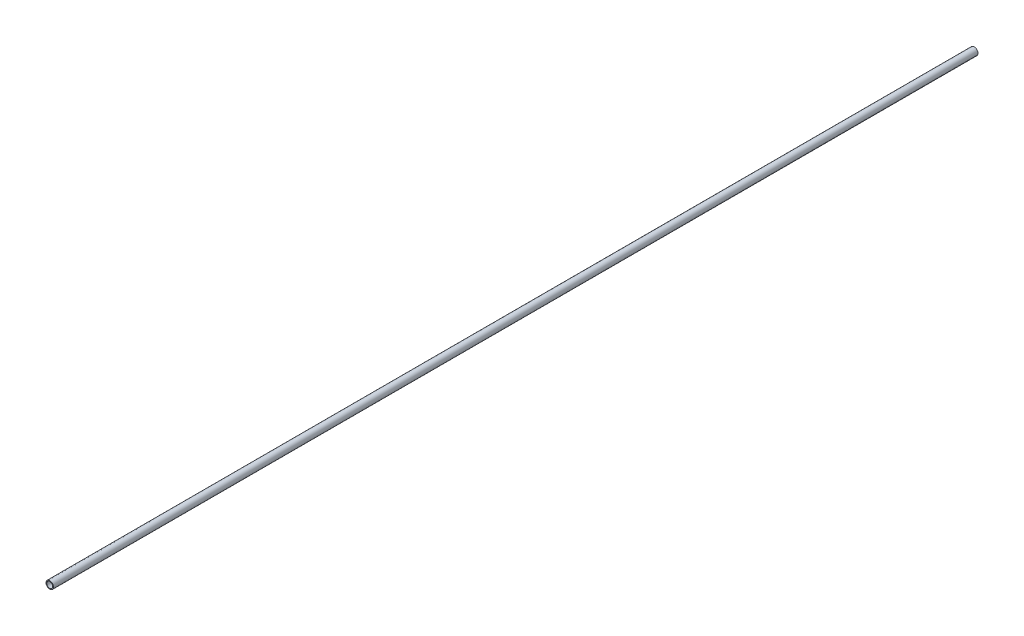
ISO-10303-21;
HEADER;
FILE_DESCRIPTION(('STEP AP214'),'2;1');
FILE_NAME('part.step','',(''),(''),'','','');
FILE_SCHEMA(('AUTOMOTIVE_DESIGN { 1 0 10303 214 1 1 1 1 }'));
ENDSEC;
DATA;
#1=APPLICATION_CONTEXT('core data for automotive mechanical design processes');
#2=APPLICATION_PROTOCOL_DEFINITION('international standard','automotive_design',2000,#1);
#3=PRODUCT_CONTEXT('',#1,'mechanical');
#4=PRODUCT('Part','Part','',(#3));
#5=PRODUCT_RELATED_PRODUCT_CATEGORY('part','',(#4));
#6=PRODUCT_DEFINITION_FORMATION('','',#4);
#7=PRODUCT_DEFINITION_CONTEXT('part definition',#1,'design');
#8=PRODUCT_DEFINITION('design','',#6,#7);
#9=PRODUCT_DEFINITION_SHAPE('','',#8);
#10=(LENGTH_UNIT() NAMED_UNIT(*) SI_UNIT(.MILLI.,.METRE.));
#11=(NAMED_UNIT(*) PLANE_ANGLE_UNIT() SI_UNIT($,.RADIAN.));
#12=(NAMED_UNIT(*) SI_UNIT($,.STERADIAN.) SOLID_ANGLE_UNIT());
#13=UNCERTAINTY_MEASURE_WITH_UNIT(LENGTH_MEASURE(1.E-05),#10,'distance_accuracy_value','');
#14=(GEOMETRIC_REPRESENTATION_CONTEXT(3) GLOBAL_UNCERTAINTY_ASSIGNED_CONTEXT((#13)) GLOBAL_UNIT_ASSIGNED_CONTEXT((#10,
#11,#12)) REPRESENTATION_CONTEXT('',''));
#15=CARTESIAN_POINT('',(0.,0.,0.));
#16=DIRECTION('',(0.,0.,1.));
#17=DIRECTION('',(1.,0.,0.));
#18=AXIS2_PLACEMENT_3D('',#15,#16,#17);
#19=CARTESIAN_POINT('',(0.,0.,1233.));
#20=DIRECTION('',(0.,0.,1.));
#21=DIRECTION('',(1.,0.,0.));
#22=AXIS2_PLACEMENT_3D('',#19,#20,#21);
#23=PLANE('',#22);
#24=CARTESIAN_POINT('',(0.,0.,1233.));
#25=DIRECTION('',(0.,0.,1.));
#26=DIRECTION('',(1.,0.,0.));
#27=AXIS2_PLACEMENT_3D('',#24,#25,#26);
#28=CIRCLE('',#27,5.);
#29=CARTESIAN_POINT('',(5.,0.,1233.));
#30=VERTEX_POINT('',#29);
#31=EDGE_CURVE('E10',#30,#30,#28,.T.);
#32=ORIENTED_EDGE('',*,*,#31,.T.);
#33=EDGE_LOOP('',(#32));
#34=FACE_BOUND('',#33,.T.);
#35=CARTESIAN_POINT('',(0.,0.,1233.));
#36=DIRECTION('',(0.,0.,1.));
#37=DIRECTION('',(1.,0.,0.));
#38=AXIS2_PLACEMENT_3D('',#35,#36,#37);
#39=CIRCLE('',#38,4.);
#40=CARTESIAN_POINT('',(4.,0.,1233.));
#41=VERTEX_POINT('',#40);
#42=EDGE_CURVE('E50',#41,#41,#39,.T.);
#43=ORIENTED_EDGE('',*,*,#42,.F.);
#44=EDGE_LOOP('',(#43));
#45=FACE_BOUND('',#44,.T.);
#46=ADVANCED_FACE('F39',(#34,#45),#23,.T.);
#47=CARTESIAN_POINT('',(0.,0.,0.));
#48=DIRECTION('',(0.,0.,1.));
#49=DIRECTION('',(1.,0.,0.));
#50=AXIS2_PLACEMENT_3D('',#47,#48,#49);
#51=PLANE('',#50);
#52=CARTESIAN_POINT('',(0.,0.,0.));
#53=DIRECTION('',(0.,0.,1.));
#54=DIRECTION('',(1.,0.,0.));
#55=AXIS2_PLACEMENT_3D('',#52,#53,#54);
#56=CIRCLE('',#55,5.);
#57=CARTESIAN_POINT('',(5.,0.,0.));
#58=VERTEX_POINT('',#57);
#59=EDGE_CURVE('E43',#58,#58,#56,.T.);
#60=ORIENTED_EDGE('',*,*,#59,.F.);
#61=EDGE_LOOP('',(#60));
#62=FACE_BOUND('',#61,.T.);
#63=CARTESIAN_POINT('',(0.,0.,0.));
#64=DIRECTION('',(0.,0.,1.));
#65=DIRECTION('',(1.,0.,0.));
#66=AXIS2_PLACEMENT_3D('',#63,#64,#65);
#67=CIRCLE('',#66,4.);
#68=CARTESIAN_POINT('',(4.,0.,0.));
#69=VERTEX_POINT('',#68);
#70=EDGE_CURVE('E52',#69,#69,#67,.T.);
#71=ORIENTED_EDGE('',*,*,#70,.T.);
#72=EDGE_LOOP('',(#71));
#73=FACE_BOUND('',#72,.T.);
#74=ADVANCED_FACE('F62',(#62,#73),#51,.F.);
#75=CARTESIAN_POINT('',(0.,0.,1233.));
#76=DIRECTION('',(0.,0.,-1.));
#77=DIRECTION('',(-1.,0.,0.));
#78=AXIS2_PLACEMENT_3D('',#75,#76,#77);
#79=CYLINDRICAL_SURFACE('',#78,5.);
#80=ORIENTED_EDGE('',*,*,#31,.F.);
#81=EDGE_LOOP('',(#80));
#82=FACE_BOUND('',#81,.T.);
#83=ORIENTED_EDGE('',*,*,#59,.T.);
#84=EDGE_LOOP('',(#83));
#85=FACE_BOUND('',#84,.T.);
#86=ADVANCED_FACE('F41',(#82,#85),#79,.T.);
#87=CARTESIAN_POINT('',(0.,0.,1233.));
#88=DIRECTION('',(0.,0.,-1.));
#89=DIRECTION('',(-1.,0.,0.));
#90=AXIS2_PLACEMENT_3D('',#87,#88,#89);
#91=CYLINDRICAL_SURFACE('',#90,4.);
#92=ORIENTED_EDGE('',*,*,#42,.T.);
#93=EDGE_LOOP('',(#92));
#94=FACE_BOUND('',#93,.T.);
#95=ORIENTED_EDGE('',*,*,#70,.F.);
#96=EDGE_LOOP('',(#95));
#97=FACE_BOUND('',#96,.T.);
#98=ADVANCED_FACE('F58',(#94,#97),#91,.F.);
#99=CLOSED_SHELL('',(#46,#74,#86,#98));
#100=MANIFOLD_SOLID_BREP('B2',#99);
#101=ADVANCED_BREP_SHAPE_REPRESENTATION('',(#18,#100),#14);
#102=SHAPE_DEFINITION_REPRESENTATION(#9,#101);
ENDSEC;
END-ISO-10303-21;
